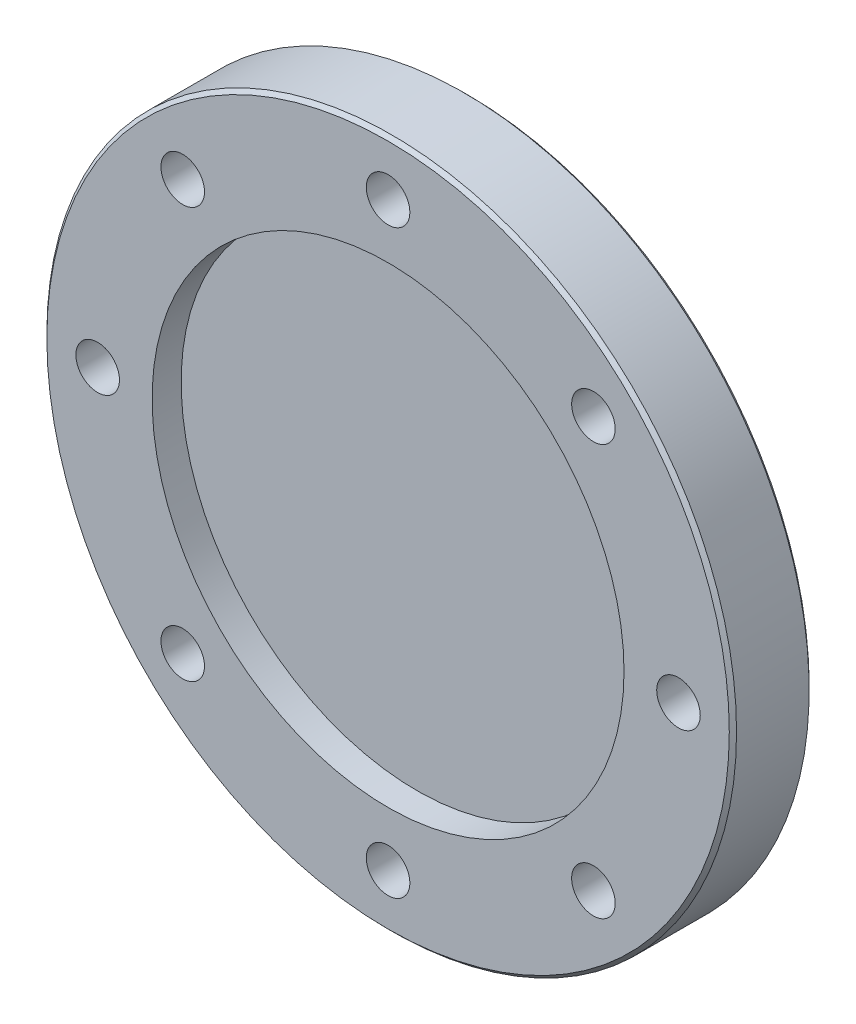
ISO-10303-21;
HEADER;
FILE_DESCRIPTION(('STEP AP214'),'2;1');
FILE_NAME('part.step','',(''),(''),'','','');
FILE_SCHEMA(('AUTOMOTIVE_DESIGN { 1 0 10303 214 1 1 1 1 }'));
ENDSEC;
DATA;
#1=APPLICATION_CONTEXT('core data for automotive mechanical design processes');
#2=APPLICATION_PROTOCOL_DEFINITION('international standard','automotive_design',2000,#1);
#3=PRODUCT_CONTEXT('',#1,'mechanical');
#4=PRODUCT('Part','Part','',(#3));
#5=PRODUCT_RELATED_PRODUCT_CATEGORY('part','',(#4));
#6=PRODUCT_DEFINITION_FORMATION('','',#4);
#7=PRODUCT_DEFINITION_CONTEXT('part definition',#1,'design');
#8=PRODUCT_DEFINITION('design','',#6,#7);
#9=PRODUCT_DEFINITION_SHAPE('','',#8);
#10=(LENGTH_UNIT() NAMED_UNIT(*) SI_UNIT(.MILLI.,.METRE.));
#11=(NAMED_UNIT(*) PLANE_ANGLE_UNIT() SI_UNIT($,.RADIAN.));
#12=(NAMED_UNIT(*) SI_UNIT($,.STERADIAN.) SOLID_ANGLE_UNIT());
#13=UNCERTAINTY_MEASURE_WITH_UNIT(LENGTH_MEASURE(1.E-05),#10,'distance_accuracy_value','');
#14=(GEOMETRIC_REPRESENTATION_CONTEXT(3) GLOBAL_UNCERTAINTY_ASSIGNED_CONTEXT((#13)) GLOBAL_UNIT_ASSIGNED_CONTEXT((#10,
#11,#12)) REPRESENTATION_CONTEXT('',''));
#15=CARTESIAN_POINT('',(0.,0.,0.));
#16=DIRECTION('',(0.,0.,1.));
#17=DIRECTION('',(1.,0.,0.));
#18=AXIS2_PLACEMENT_3D('',#15,#16,#17);
#19=CARTESIAN_POINT('',(0.,0.,0.));
#20=DIRECTION('',(0.,0.,1.));
#21=DIRECTION('',(1.,0.,0.));
#22=AXIS2_PLACEMENT_3D('',#19,#20,#21);
#23=PLANE('',#22);
#24=CARTESIAN_POINT('',(0.,0.,0.));
#25=DIRECTION('',(0.,0.,1.));
#26=DIRECTION('',(1.,0.,0.));
#27=AXIS2_PLACEMENT_3D('',#24,#25,#26);
#28=CIRCLE('',#27,47.);
#29=CARTESIAN_POINT('',(47.,0.,0.));
#30=VERTEX_POINT('',#29);
#31=EDGE_CURVE('E11',#30,#30,#28,.T.);
#32=ORIENTED_EDGE('',*,*,#31,.T.);
#33=EDGE_LOOP('',(#32));
#34=FACE_BOUND('',#33,.T.);
#35=CARTESIAN_POINT('',(0.,40.,0.));
#36=DIRECTION('',(0.,0.,1.));
#37=DIRECTION('',(1.,0.,0.));
#38=AXIS2_PLACEMENT_3D('',#35,#36,#37);
#39=CIRCLE('',#38,3.);
#40=CARTESIAN_POINT('',(3.,40.,0.));
#41=VERTEX_POINT('',#40);
#42=EDGE_CURVE('E67',#41,#41,#39,.F.);
#43=ORIENTED_EDGE('',*,*,#42,.T.);
#44=EDGE_LOOP('',(#43));
#45=FACE_BOUND('',#44,.T.);
#46=CARTESIAN_POINT('',(-28.2842712474619,28.2842712474619,0.));
#47=DIRECTION('',(0.,0.,1.));
#48=DIRECTION('',(1.,0.,0.));
#49=AXIS2_PLACEMENT_3D('',#46,#47,#48);
#50=CIRCLE('',#49,3.00000000000007);
#51=CARTESIAN_POINT('',(-25.2842712474618,28.2842712474619,0.));
#52=VERTEX_POINT('',#51);
#53=EDGE_CURVE('E411',#52,#52,#50,.F.);
#54=ORIENTED_EDGE('',*,*,#53,.T.);
#55=EDGE_LOOP('',(#54));
#56=FACE_BOUND('',#55,.T.);
#57=CARTESIAN_POINT('',(-40.,0.,0.));
#58=DIRECTION('',(0.,0.,1.));
#59=DIRECTION('',(1.,0.,0.));
#60=AXIS2_PLACEMENT_3D('',#57,#58,#59);
#61=CIRCLE('',#60,3.00000000000014);
#62=CARTESIAN_POINT('',(-36.9999999999999,0.,0.));
#63=VERTEX_POINT('',#62);
#64=EDGE_CURVE('E407',#63,#63,#61,.F.);
#65=ORIENTED_EDGE('',*,*,#64,.T.);
#66=EDGE_LOOP('',(#65));
#67=FACE_BOUND('',#66,.T.);
#68=CARTESIAN_POINT('',(-28.2842712474619,-28.2842712474619,0.));
#69=DIRECTION('',(0.,0.,1.));
#70=DIRECTION('',(1.,0.,0.));
#71=AXIS2_PLACEMENT_3D('',#68,#69,#70);
#72=CIRCLE('',#71,3.0000000000002);
#73=CARTESIAN_POINT('',(-25.2842712474617,-28.2842712474619,0.));
#74=VERTEX_POINT('',#73);
#75=EDGE_CURVE('E403',#74,#74,#72,.F.);
#76=ORIENTED_EDGE('',*,*,#75,.T.);
#77=EDGE_LOOP('',(#76));
#78=FACE_BOUND('',#77,.T.);
#79=CARTESIAN_POINT('',(0.,-40.,0.));
#80=DIRECTION('',(0.,0.,1.));
#81=DIRECTION('',(1.,0.,0.));
#82=AXIS2_PLACEMENT_3D('',#79,#80,#81);
#83=CIRCLE('',#82,3.00000000000028);
#84=CARTESIAN_POINT('',(3.00000000000027,-40.,0.));
#85=VERTEX_POINT('',#84);
#86=EDGE_CURVE('E399',#85,#85,#83,.F.);
#87=ORIENTED_EDGE('',*,*,#86,.T.);
#88=EDGE_LOOP('',(#87));
#89=FACE_BOUND('',#88,.T.);
#90=CARTESIAN_POINT('',(28.2842712474619,-28.2842712474619,0.));
#91=DIRECTION('',(0.,0.,1.));
#92=DIRECTION('',(1.,0.,0.));
#93=AXIS2_PLACEMENT_3D('',#90,#91,#92);
#94=CIRCLE('',#93,3.00000000000034);
#95=CARTESIAN_POINT('',(31.2842712474622,-28.2842712474619,0.));
#96=VERTEX_POINT('',#95);
#97=EDGE_CURVE('E395',#96,#96,#94,.F.);
#98=ORIENTED_EDGE('',*,*,#97,.T.);
#99=EDGE_LOOP('',(#98));
#100=FACE_BOUND('',#99,.T.);
#101=CARTESIAN_POINT('',(40.,0.,0.));
#102=DIRECTION('',(0.,0.,1.));
#103=DIRECTION('',(1.,0.,0.));
#104=AXIS2_PLACEMENT_3D('',#101,#102,#103);
#105=CIRCLE('',#104,3.00000000000041);
#106=CARTESIAN_POINT('',(43.0000000000004,0.,0.));
#107=VERTEX_POINT('',#106);
#108=EDGE_CURVE('E390',#107,#107,#105,.F.);
#109=ORIENTED_EDGE('',*,*,#108,.T.);
#110=EDGE_LOOP('',(#109));
#111=FACE_BOUND('',#110,.T.);
#112=CARTESIAN_POINT('',(28.2842712474619,28.2842712474619,0.));
#113=DIRECTION('',(0.,0.,1.));
#114=DIRECTION('',(1.,0.,0.));
#115=AXIS2_PLACEMENT_3D('',#112,#113,#114);
#116=CIRCLE('',#115,3.00000000000047);
#117=CARTESIAN_POINT('',(31.2842712474624,28.2842712474619,0.));
#118=VERTEX_POINT('',#117);
#119=EDGE_CURVE('E71',#118,#118,#116,.F.);
#120=ORIENTED_EDGE('',*,*,#119,.T.);
#121=EDGE_LOOP('',(#120));
#122=FACE_BOUND('',#121,.T.);
#123=CARTESIAN_POINT('',(0.,0.,0.));
#124=DIRECTION('',(0.,0.,1.));
#125=DIRECTION('',(1.,0.,0.));
#126=AXIS2_PLACEMENT_3D('',#123,#124,#125);
#127=CIRCLE('',#126,32.5);
#128=CARTESIAN_POINT('',(32.5,0.,0.));
#129=VERTEX_POINT('',#128);
#130=EDGE_CURVE('E60',#129,#129,#127,.T.);
#131=ORIENTED_EDGE('',*,*,#130,.F.);
#132=EDGE_LOOP('',(#131));
#133=FACE_BOUND('',#132,.T.);
#134=ADVANCED_FACE('F39',(#34,#45,#56,#67,#78,#89,#100,#111,#122,#133),#23,.T.);
#135=CARTESIAN_POINT('',(0.,0.,0.));
#136=DIRECTION('',(0.,0.,-1.));
#137=DIRECTION('',(-1.,0.,0.));
#138=AXIS2_PLACEMENT_3D('',#135,#136,#137);
#139=CYLINDRICAL_SURFACE('',#138,47.5);
#140=CARTESIAN_POINT('',(0.,0.,-10.4999999999999));
#141=DIRECTION('',(0.,0.,-1.));
#142=DIRECTION('',(-1.,0.,0.));
#143=AXIS2_PLACEMENT_3D('',#140,#141,#142);
#144=CIRCLE('',#143,47.5);
#145=CARTESIAN_POINT('',(-47.5,0.,-10.4999999999999));
#146=VERTEX_POINT('',#145);
#147=EDGE_CURVE('E47',#146,#146,#144,.F.);
#148=ORIENTED_EDGE('',*,*,#147,.T.);
#149=EDGE_LOOP('',(#148));
#150=FACE_BOUND('',#149,.T.);
#151=CARTESIAN_POINT('',(0.,0.,-0.500000000000021));
#152=DIRECTION('',(0.,0.,1.));
#153=DIRECTION('',(1.,0.,0.));
#154=AXIS2_PLACEMENT_3D('',#151,#152,#153);
#155=CIRCLE('',#154,47.5);
#156=CARTESIAN_POINT('',(47.5,0.,-0.500000000000021));
#157=VERTEX_POINT('',#156);
#158=EDGE_CURVE('E99',#157,#157,#155,.F.);
#159=ORIENTED_EDGE('',*,*,#158,.T.);
#160=EDGE_LOOP('',(#159));
#161=FACE_BOUND('',#160,.T.);
#162=ADVANCED_FACE('F104',(#150,#161),#139,.T.);
#163=CARTESIAN_POINT('',(0.,47.5,-11.));
#164=DIRECTION('',(0.,0.,-1.));
#165=DIRECTION('',(-1.,0.,0.));
#166=AXIS2_PLACEMENT_3D('',#163,#164,#165);
#167=PLANE('',#166);
#168=CARTESIAN_POINT('',(0.,0.,-11.));
#169=DIRECTION('',(0.,0.,-1.));
#170=DIRECTION('',(-1.,0.,0.));
#171=AXIS2_PLACEMENT_3D('',#168,#169,#170);
#172=CIRCLE('',#171,47.);
#173=CARTESIAN_POINT('',(-47.,0.,-11.));
#174=VERTEX_POINT('',#173);
#175=EDGE_CURVE('E96',#174,#174,#172,.T.);
#176=ORIENTED_EDGE('',*,*,#175,.T.);
#177=EDGE_LOOP('',(#176));
#178=FACE_BOUND('',#177,.T.);
#179=CARTESIAN_POINT('',(0.,40.,-11.));
#180=DIRECTION('',(0.,0.,-1.));
#181=DIRECTION('',(-1.,0.,0.));
#182=AXIS2_PLACEMENT_3D('',#179,#180,#181);
#183=CIRCLE('',#182,3.);
#184=CARTESIAN_POINT('',(-3.,40.,-11.));
#185=VERTEX_POINT('',#184);
#186=EDGE_CURVE('E61',#185,#185,#183,.T.);
#187=ORIENTED_EDGE('',*,*,#186,.F.);
#188=EDGE_LOOP('',(#187));
#189=FACE_BOUND('',#188,.T.);
#190=CARTESIAN_POINT('',(-28.2842712474619,28.2842712474619,-11.));
#191=DIRECTION('',(0.,0.,-1.));
#192=DIRECTION('',(-1.,0.,0.));
#193=AXIS2_PLACEMENT_3D('',#190,#191,#192);
#194=CIRCLE('',#193,3.00000000000007);
#195=CARTESIAN_POINT('',(-31.284271247462,28.2842712474619,-11.));
#196=VERTEX_POINT('',#195);
#197=EDGE_CURVE('E123',#196,#196,#194,.T.);
#198=ORIENTED_EDGE('',*,*,#197,.F.);
#199=EDGE_LOOP('',(#198));
#200=FACE_BOUND('',#199,.T.);
#201=CARTESIAN_POINT('',(-40.,0.,-11.));
#202=DIRECTION('',(0.,0.,-1.));
#203=DIRECTION('',(-1.,0.,0.));
#204=AXIS2_PLACEMENT_3D('',#201,#202,#203);
#205=CIRCLE('',#204,3.00000000000014);
#206=CARTESIAN_POINT('',(-43.0000000000001,0.,-11.));
#207=VERTEX_POINT('',#206);
#208=EDGE_CURVE('E127',#207,#207,#205,.T.);
#209=ORIENTED_EDGE('',*,*,#208,.F.);
#210=EDGE_LOOP('',(#209));
#211=FACE_BOUND('',#210,.T.);
#212=CARTESIAN_POINT('',(-28.2842712474619,-28.2842712474619,-11.));
#213=DIRECTION('',(0.,0.,-1.));
#214=DIRECTION('',(-1.,0.,0.));
#215=AXIS2_PLACEMENT_3D('',#212,#213,#214);
#216=CIRCLE('',#215,3.0000000000002);
#217=CARTESIAN_POINT('',(-31.2842712474621,-28.2842712474619,-11.));
#218=VERTEX_POINT('',#217);
#219=EDGE_CURVE('E131',#218,#218,#216,.T.);
#220=ORIENTED_EDGE('',*,*,#219,.F.);
#221=EDGE_LOOP('',(#220));
#222=FACE_BOUND('',#221,.T.);
#223=CARTESIAN_POINT('',(0.,-40.,-11.));
#224=DIRECTION('',(0.,0.,-1.));
#225=DIRECTION('',(-1.,0.,0.));
#226=AXIS2_PLACEMENT_3D('',#223,#224,#225);
#227=CIRCLE('',#226,3.00000000000028);
#228=CARTESIAN_POINT('',(-3.00000000000029,-40.,-11.));
#229=VERTEX_POINT('',#228);
#230=EDGE_CURVE('E135',#229,#229,#227,.T.);
#231=ORIENTED_EDGE('',*,*,#230,.F.);
#232=EDGE_LOOP('',(#231));
#233=FACE_BOUND('',#232,.T.);
#234=CARTESIAN_POINT('',(28.2842712474619,-28.2842712474619,-11.));
#235=DIRECTION('',(0.,0.,-1.));
#236=DIRECTION('',(-1.,0.,0.));
#237=AXIS2_PLACEMENT_3D('',#234,#235,#236);
#238=CIRCLE('',#237,3.00000000000034);
#239=CARTESIAN_POINT('',(25.2842712474616,-28.2842712474619,-11.));
#240=VERTEX_POINT('',#239);
#241=EDGE_CURVE('E139',#240,#240,#238,.T.);
#242=ORIENTED_EDGE('',*,*,#241,.F.);
#243=EDGE_LOOP('',(#242));
#244=FACE_BOUND('',#243,.T.);
#245=CARTESIAN_POINT('',(40.,0.,-11.));
#246=DIRECTION('',(0.,0.,-1.));
#247=DIRECTION('',(-1.,0.,0.));
#248=AXIS2_PLACEMENT_3D('',#245,#246,#247);
#249=CIRCLE('',#248,3.00000000000041);
#250=CARTESIAN_POINT('',(36.9999999999996,0.,-11.));
#251=VERTEX_POINT('',#250);
#252=EDGE_CURVE('E143',#251,#251,#249,.T.);
#253=ORIENTED_EDGE('',*,*,#252,.F.);
#254=EDGE_LOOP('',(#253));
#255=FACE_BOUND('',#254,.T.);
#256=CARTESIAN_POINT('',(28.2842712474619,28.2842712474619,-11.));
#257=DIRECTION('',(0.,0.,-1.));
#258=DIRECTION('',(-1.,0.,0.));
#259=AXIS2_PLACEMENT_3D('',#256,#257,#258);
#260=CIRCLE('',#259,3.00000000000047);
#261=CARTESIAN_POINT('',(25.2842712474614,28.2842712474619,-11.));
#262=VERTEX_POINT('',#261);
#263=EDGE_CURVE('E147',#262,#262,#260,.T.);
#264=ORIENTED_EDGE('',*,*,#263,.F.);
#265=EDGE_LOOP('',(#264));
#266=FACE_BOUND('',#265,.T.);
#267=CARTESIAN_POINT('',(0.,0.,-11.));
#268=DIRECTION('',(0.,0.,-1.));
#269=DIRECTION('',(-1.,0.,0.));
#270=AXIS2_PLACEMENT_3D('',#267,#268,#269);
#271=CIRCLE('',#270,19.);
#272=CARTESIAN_POINT('',(-19.,0.,-11.));
#273=VERTEX_POINT('',#272);
#274=EDGE_CURVE('E81',#273,#273,#271,.T.);
#275=ORIENTED_EDGE('',*,*,#274,.F.);
#276=EDGE_LOOP('',(#275));
#277=FACE_BOUND('',#276,.T.);
#278=ADVANCED_FACE('F113',(#178,#189,#200,#211,#222,#233,#244,#255,#266,#277),#167,.T.);
#279=CARTESIAN_POINT('',(0.,0.,0.));
#280=DIRECTION('',(0.,0.,-1.));
#281=DIRECTION('',(-1.,0.,0.));
#282=AXIS2_PLACEMENT_3D('',#279,#280,#281);
#283=CYLINDRICAL_SURFACE('',#282,19.);
#284=ORIENTED_EDGE('',*,*,#274,.T.);
#285=EDGE_LOOP('',(#284));
#286=FACE_BOUND('',#285,.T.);
#287=CARTESIAN_POINT('',(0.,0.,-12.));
#288=DIRECTION('',(0.,0.,-1.));
#289=DIRECTION('',(-1.,0.,0.));
#290=AXIS2_PLACEMENT_3D('',#287,#288,#289);
#291=CIRCLE('',#290,19.);
#292=CARTESIAN_POINT('',(-19.,0.,-12.));
#293=VERTEX_POINT('',#292);
#294=EDGE_CURVE('E78',#293,#293,#291,.T.);
#295=ORIENTED_EDGE('',*,*,#294,.F.);
#296=EDGE_LOOP('',(#295));
#297=FACE_BOUND('',#296,.T.);
#298=ADVANCED_FACE('F116',(#286,#297),#283,.T.);
#299=CARTESIAN_POINT('',(0.,19.,-12.));
#300=DIRECTION('',(0.,0.,-1.));
#301=DIRECTION('',(-1.,0.,0.));
#302=AXIS2_PLACEMENT_3D('',#299,#300,#301);
#303=PLANE('',#302);
#304=ORIENTED_EDGE('',*,*,#294,.T.);
#305=EDGE_LOOP('',(#304));
#306=FACE_BOUND('',#305,.T.);
#307=CARTESIAN_POINT('',(0.,0.,-12.));
#308=DIRECTION('',(0.,0.,-1.));
#309=DIRECTION('',(-1.,0.,0.));
#310=AXIS2_PLACEMENT_3D('',#307,#308,#309);
#311=CIRCLE('',#310,15.);
#312=CARTESIAN_POINT('',(-15.,0.,-12.));
#313=VERTEX_POINT('',#312);
#314=EDGE_CURVE('E74',#313,#313,#311,.T.);
#315=ORIENTED_EDGE('',*,*,#314,.F.);
#316=EDGE_LOOP('',(#315));
#317=FACE_BOUND('',#316,.T.);
#318=ADVANCED_FACE('F152',(#306,#317),#303,.T.);
#319=CARTESIAN_POINT('',(0.,0.,0.));
#320=DIRECTION('',(0.,0.,-1.));
#321=DIRECTION('',(-1.,0.,0.));
#322=AXIS2_PLACEMENT_3D('',#319,#320,#321);
#323=CYLINDRICAL_SURFACE('',#322,15.);
#324=CARTESIAN_POINT('',(0.,0.,-30.5));
#325=DIRECTION('',(0.,0.,-1.));
#326=DIRECTION('',(-1.,0.,0.));
#327=AXIS2_PLACEMENT_3D('',#324,#325,#326);
#328=CIRCLE('',#327,15.);
#329=CARTESIAN_POINT('',(-15.,0.,-30.5));
#330=VERTEX_POINT('',#329);
#331=EDGE_CURVE('E93',#330,#330,#328,.F.);
#332=ORIENTED_EDGE('',*,*,#331,.T.);
#333=EDGE_LOOP('',(#332));
#334=FACE_BOUND('',#333,.T.);
#335=ORIENTED_EDGE('',*,*,#314,.T.);
#336=EDGE_LOOP('',(#335));
#337=FACE_BOUND('',#336,.T.);
#338=ADVANCED_FACE('F158',(#334,#337),#323,.T.);
#339=CARTESIAN_POINT('',(0.,15.,-31.));
#340=DIRECTION('',(0.,0.,-1.));
#341=DIRECTION('',(-1.,0.,0.));
#342=AXIS2_PLACEMENT_3D('',#339,#340,#341);
#343=PLANE('',#342);
#344=CARTESIAN_POINT('',(0.,0.,-31.));
#345=DIRECTION('',(0.,0.,-1.));
#346=DIRECTION('',(-1.,0.,0.));
#347=AXIS2_PLACEMENT_3D('',#344,#345,#346);
#348=CIRCLE('',#347,4.50000000000002);
#349=CARTESIAN_POINT('',(-4.50000000000002,0.,-31.));
#350=VERTEX_POINT('',#349);
#351=EDGE_CURVE('E90',#350,#350,#348,.F.);
#352=ORIENTED_EDGE('',*,*,#351,.T.);
#353=EDGE_LOOP('',(#352));
#354=FACE_BOUND('',#353,.T.);
#355=CARTESIAN_POINT('',(0.,0.,-31.));
#356=DIRECTION('',(0.,0.,-1.));
#357=DIRECTION('',(-1.,0.,0.));
#358=AXIS2_PLACEMENT_3D('',#355,#356,#357);
#359=CIRCLE('',#358,14.5);
#360=CARTESIAN_POINT('',(-14.5,0.,-31.));
#361=VERTEX_POINT('',#360);
#362=EDGE_CURVE('E87',#361,#361,#359,.T.);
#363=ORIENTED_EDGE('',*,*,#362,.T.);
#364=EDGE_LOOP('',(#363));
#365=FACE_BOUND('',#364,.T.);
#366=ADVANCED_FACE('F163',(#354,#365),#343,.T.);
#367=CARTESIAN_POINT('',(0.,0.,-4.));
#368=DIRECTION('',(0.,0.,1.));
#369=DIRECTION('',(1.,0.,0.));
#370=AXIS2_PLACEMENT_3D('',#367,#368,#369);
#371=CYLINDRICAL_SURFACE('',#370,32.5);
#372=CARTESIAN_POINT('',(0.,0.,-4.));
#373=DIRECTION('',(0.,0.,1.));
#374=DIRECTION('',(1.,0.,0.));
#375=AXIS2_PLACEMENT_3D('',#372,#373,#374);
#376=CIRCLE('',#375,32.5);
#377=CARTESIAN_POINT('',(32.5,0.,-4.));
#378=VERTEX_POINT('',#377);
#379=EDGE_CURVE('E64',#378,#378,#376,.T.);
#380=ORIENTED_EDGE('',*,*,#379,.F.);
#381=EDGE_LOOP('',(#380));
#382=FACE_BOUND('',#381,.T.);
#383=ORIENTED_EDGE('',*,*,#130,.T.);
#384=EDGE_LOOP('',(#383));
#385=FACE_BOUND('',#384,.T.);
#386=ADVANCED_FACE('F169',(#382,#385),#371,.F.);
#387=CARTESIAN_POINT('',(0.,0.,-4.));
#388=DIRECTION('',(0.,0.,1.));
#389=DIRECTION('',(1.,0.,0.));
#390=AXIS2_PLACEMENT_3D('',#387,#388,#389);
#391=PLANE('',#390);
#392=ORIENTED_EDGE('',*,*,#379,.T.);
#393=EDGE_LOOP('',(#392));
#394=FACE_BOUND('',#393,.T.);
#395=ADVANCED_FACE('F54',(#394),#391,.T.);
#396=CARTESIAN_POINT('',(0.,0.,-16.));
#397=DIRECTION('',(0.,0.,-1.));
#398=DIRECTION('',(-1.,0.,0.));
#399=AXIS2_PLACEMENT_3D('',#396,#397,#398);
#400=CONICAL_SURFACE('',#399,4.,1.02974425867665);
#401=CARTESIAN_POINT('',(0.,0.,-13.5965575238898));
#402=VERTEX_POINT('',#401);
#403=VERTEX_LOOP('',#402);
#404=FACE_BOUND('',#403,.T.);
#405=CARTESIAN_POINT('',(0.,0.,-16.));
#406=DIRECTION('',(0.,0.,-1.));
#407=DIRECTION('',(-1.,0.,0.));
#408=AXIS2_PLACEMENT_3D('',#405,#406,#407);
#409=CIRCLE('',#408,4.);
#410=CARTESIAN_POINT('',(-4.,0.,-16.));
#411=VERTEX_POINT('',#410);
#412=EDGE_CURVE('E58',#411,#411,#409,.T.);
#413=ORIENTED_EDGE('',*,*,#412,.T.);
#414=EDGE_LOOP('',(#413));
#415=FACE_BOUND('',#414,.T.);
#416=ADVANCED_FACE('F50',(#404,#415),#400,.F.);
#417=CARTESIAN_POINT('',(0.,0.,-31.));
#418=DIRECTION('',(0.,0.,-1.));
#419=DIRECTION('',(-1.,0.,0.));
#420=AXIS2_PLACEMENT_3D('',#417,#418,#419);
#421=CYLINDRICAL_SURFACE('',#420,4.);
#422=CARTESIAN_POINT('',(0.,0.,-30.5));
#423=DIRECTION('',(0.,0.,-1.));
#424=DIRECTION('',(-1.,0.,0.));
#425=AXIS2_PLACEMENT_3D('',#422,#423,#424);
#426=CIRCLE('',#425,4.);
#427=CARTESIAN_POINT('',(-4.,0.,-30.5));
#428=VERTEX_POINT('',#427);
#429=EDGE_CURVE('E84',#428,#428,#426,.T.);
#430=ORIENTED_EDGE('',*,*,#429,.T.);
#431=EDGE_LOOP('',(#430));
#432=FACE_BOUND('',#431,.T.);
#433=ORIENTED_EDGE('',*,*,#412,.F.);
#434=EDGE_LOOP('',(#433));
#435=FACE_BOUND('',#434,.T.);
#436=ADVANCED_FACE('F53',(#432,#435),#421,.F.);
#437=CARTESIAN_POINT('',(28.2842712474619,28.2842712474619,0.000999999999999265));
#438=DIRECTION('',(0.,0.,-1.));
#439=DIRECTION('',(-1.,0.,0.));
#440=AXIS2_PLACEMENT_3D('',#437,#438,#439);
#441=CYLINDRICAL_SURFACE('',#440,3.00000000000047);
#442=ORIENTED_EDGE('',*,*,#119,.F.);
#443=EDGE_LOOP('',(#442));
#444=FACE_BOUND('',#443,.T.);
#445=ORIENTED_EDGE('',*,*,#263,.T.);
#446=EDGE_LOOP('',(#445));
#447=FACE_BOUND('',#446,.T.);
#448=ADVANCED_FACE('F290',(#444,#447),#441,.F.);
#449=CARTESIAN_POINT('',(40.,0.,0.000999999999999265));
#450=DIRECTION('',(0.,0.,-1.));
#451=DIRECTION('',(-1.,0.,0.));
#452=AXIS2_PLACEMENT_3D('',#449,#450,#451);
#453=CYLINDRICAL_SURFACE('',#452,3.00000000000041);
#454=ORIENTED_EDGE('',*,*,#108,.F.);
#455=EDGE_LOOP('',(#454));
#456=FACE_BOUND('',#455,.T.);
#457=ORIENTED_EDGE('',*,*,#252,.T.);
#458=EDGE_LOOP('',(#457));
#459=FACE_BOUND('',#458,.T.);
#460=ADVANCED_FACE('F281',(#456,#459),#453,.F.);
#461=CARTESIAN_POINT('',(28.2842712474619,-28.2842712474619,0.000999999999999265));
#462=DIRECTION('',(0.,0.,-1.));
#463=DIRECTION('',(-1.,0.,0.));
#464=AXIS2_PLACEMENT_3D('',#461,#462,#463);
#465=CYLINDRICAL_SURFACE('',#464,3.00000000000034);
#466=ORIENTED_EDGE('',*,*,#97,.F.);
#467=EDGE_LOOP('',(#466));
#468=FACE_BOUND('',#467,.T.);
#469=ORIENTED_EDGE('',*,*,#241,.T.);
#470=EDGE_LOOP('',(#469));
#471=FACE_BOUND('',#470,.T.);
#472=ADVANCED_FACE('F272',(#468,#471),#465,.F.);
#473=CARTESIAN_POINT('',(0.,-40.,0.000999999999999265));
#474=DIRECTION('',(0.,0.,-1.));
#475=DIRECTION('',(-1.,0.,0.));
#476=AXIS2_PLACEMENT_3D('',#473,#474,#475);
#477=CYLINDRICAL_SURFACE('',#476,3.00000000000028);
#478=ORIENTED_EDGE('',*,*,#86,.F.);
#479=EDGE_LOOP('',(#478));
#480=FACE_BOUND('',#479,.T.);
#481=ORIENTED_EDGE('',*,*,#230,.T.);
#482=EDGE_LOOP('',(#481));
#483=FACE_BOUND('',#482,.T.);
#484=ADVANCED_FACE('F263',(#480,#483),#477,.F.);
#485=CARTESIAN_POINT('',(-28.2842712474619,-28.2842712474619,0.000999999999999265));
#486=DIRECTION('',(0.,0.,-1.));
#487=DIRECTION('',(-1.,0.,0.));
#488=AXIS2_PLACEMENT_3D('',#485,#486,#487);
#489=CYLINDRICAL_SURFACE('',#488,3.0000000000002);
#490=ORIENTED_EDGE('',*,*,#75,.F.);
#491=EDGE_LOOP('',(#490));
#492=FACE_BOUND('',#491,.T.);
#493=ORIENTED_EDGE('',*,*,#219,.T.);
#494=EDGE_LOOP('',(#493));
#495=FACE_BOUND('',#494,.T.);
#496=ADVANCED_FACE('F254',(#492,#495),#489,.F.);
#497=CARTESIAN_POINT('',(-40.,0.,0.000999999999999265));
#498=DIRECTION('',(0.,0.,-1.));
#499=DIRECTION('',(-1.,0.,0.));
#500=AXIS2_PLACEMENT_3D('',#497,#498,#499);
#501=CYLINDRICAL_SURFACE('',#500,3.00000000000014);
#502=ORIENTED_EDGE('',*,*,#64,.F.);
#503=EDGE_LOOP('',(#502));
#504=FACE_BOUND('',#503,.T.);
#505=ORIENTED_EDGE('',*,*,#208,.T.);
#506=EDGE_LOOP('',(#505));
#507=FACE_BOUND('',#506,.T.);
#508=ADVANCED_FACE('F245',(#504,#507),#501,.F.);
#509=CARTESIAN_POINT('',(-28.2842712474619,28.2842712474619,0.000999999999999265));
#510=DIRECTION('',(0.,0.,-1.));
#511=DIRECTION('',(-1.,0.,0.));
#512=AXIS2_PLACEMENT_3D('',#509,#510,#511);
#513=CYLINDRICAL_SURFACE('',#512,3.00000000000007);
#514=ORIENTED_EDGE('',*,*,#53,.F.);
#515=EDGE_LOOP('',(#514));
#516=FACE_BOUND('',#515,.T.);
#517=ORIENTED_EDGE('',*,*,#197,.T.);
#518=EDGE_LOOP('',(#517));
#519=FACE_BOUND('',#518,.T.);
#520=ADVANCED_FACE('F236',(#516,#519),#513,.F.);
#521=CARTESIAN_POINT('',(0.,40.,0.000999999999999265));
#522=DIRECTION('',(0.,0.,-1.));
#523=DIRECTION('',(-1.,0.,0.));
#524=AXIS2_PLACEMENT_3D('',#521,#522,#523);
#525=CYLINDRICAL_SURFACE('',#524,3.);
#526=ORIENTED_EDGE('',*,*,#42,.F.);
#527=EDGE_LOOP('',(#526));
#528=FACE_BOUND('',#527,.T.);
#529=ORIENTED_EDGE('',*,*,#186,.T.);
#530=EDGE_LOOP('',(#529));
#531=FACE_BOUND('',#530,.T.);
#532=ADVANCED_FACE('F188',(#528,#531),#525,.F.);
#533=CARTESIAN_POINT('',(0.,0.,-30.5));
#534=DIRECTION('',(0.,0.,-1.));
#535=DIRECTION('',(-1.,0.,0.));
#536=AXIS2_PLACEMENT_3D('',#533,#534,#535);
#537=CONICAL_SURFACE('',#536,4.,0.785398163397461);
#538=ORIENTED_EDGE('',*,*,#351,.F.);
#539=EDGE_LOOP('',(#538));
#540=FACE_BOUND('',#539,.T.);
#541=ORIENTED_EDGE('',*,*,#429,.F.);
#542=EDGE_LOOP('',(#541));
#543=FACE_BOUND('',#542,.T.);
#544=ADVANCED_FACE('F182',(#540,#543),#537,.F.);
#545=CARTESIAN_POINT('',(0.,0.,-31.));
#546=DIRECTION('',(0.,0.,1.));
#547=DIRECTION('',(1.,0.,0.));
#548=AXIS2_PLACEMENT_3D('',#545,#546,#547);
#549=CONICAL_SURFACE('',#548,14.5,0.78539816339745);
#550=ORIENTED_EDGE('',*,*,#331,.F.);
#551=EDGE_LOOP('',(#550));
#552=FACE_BOUND('',#551,.T.);
#553=ORIENTED_EDGE('',*,*,#362,.F.);
#554=EDGE_LOOP('',(#553));
#555=FACE_BOUND('',#554,.T.);
#556=ADVANCED_FACE('F110',(#552,#555),#549,.T.);
#557=CARTESIAN_POINT('',(0.,0.,-11.));
#558=DIRECTION('',(0.,0.,1.));
#559=DIRECTION('',(1.,0.,0.));
#560=AXIS2_PLACEMENT_3D('',#557,#558,#559);
#561=CONICAL_SURFACE('',#560,47.,0.785398163397428);
#562=ORIENTED_EDGE('',*,*,#147,.F.);
#563=EDGE_LOOP('',(#562));
#564=FACE_BOUND('',#563,.T.);
#565=ORIENTED_EDGE('',*,*,#175,.F.);
#566=EDGE_LOOP('',(#565));
#567=FACE_BOUND('',#566,.T.);
#568=ADVANCED_FACE('F107',(#564,#567),#561,.T.);
#569=CARTESIAN_POINT('',(0.,0.,-0.500000000000021));
#570=DIRECTION('',(0.,0.,-1.));
#571=DIRECTION('',(-1.,0.,0.));
#572=AXIS2_PLACEMENT_3D('',#569,#570,#571);
#573=CONICAL_SURFACE('',#572,47.5,0.785398163397448);
#574=ORIENTED_EDGE('',*,*,#31,.F.);
#575=EDGE_LOOP('',(#574));
#576=FACE_BOUND('',#575,.T.);
#577=ORIENTED_EDGE('',*,*,#158,.F.);
#578=EDGE_LOOP('',(#577));
#579=FACE_BOUND('',#578,.T.);
#580=ADVANCED_FACE('F42',(#576,#579),#573,.T.);
#581=CLOSED_SHELL('',(#134,#162,#278,#298,#318,#338,#366,#386,#395,#416,#436,#448,#460,#472,
#484,#496,#508,#520,#532,#544,#556,#568,#580));
#582=MANIFOLD_SOLID_BREP('B2',#581);
#583=ADVANCED_BREP_SHAPE_REPRESENTATION('',(#18,#582),#14);
#584=SHAPE_DEFINITION_REPRESENTATION(#9,#583);
ENDSEC;
END-ISO-10303-21;
